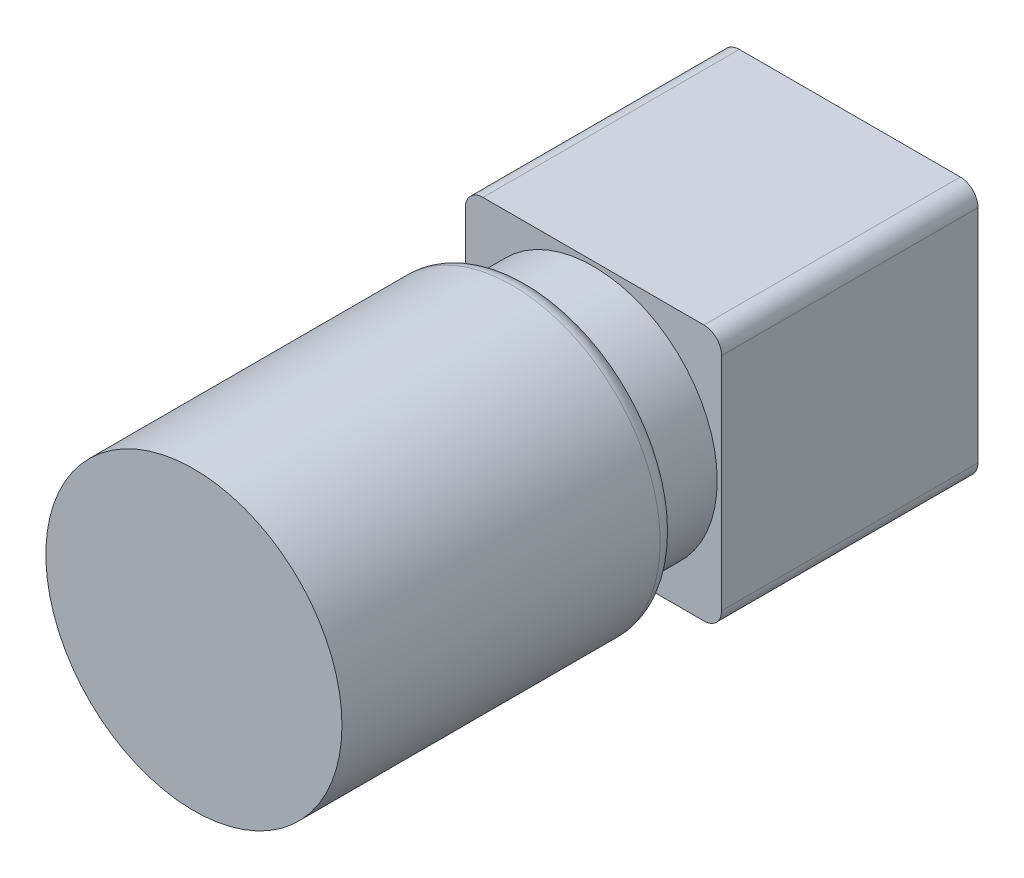
ISO-10303-21;
HEADER;
FILE_DESCRIPTION(('STEP AP214'),'2;1');
FILE_NAME('part.step','',(''),(''),'','','');
FILE_SCHEMA(('AUTOMOTIVE_DESIGN { 1 0 10303 214 1 1 1 1 }'));
ENDSEC;
DATA;
#1=APPLICATION_CONTEXT('core data for automotive mechanical design processes');
#2=APPLICATION_PROTOCOL_DEFINITION('international standard','automotive_design',2000,#1);
#3=PRODUCT_CONTEXT('',#1,'mechanical');
#4=PRODUCT('Part','Part','',(#3));
#5=PRODUCT_RELATED_PRODUCT_CATEGORY('part','',(#4));
#6=PRODUCT_DEFINITION_FORMATION('','',#4);
#7=PRODUCT_DEFINITION_CONTEXT('part definition',#1,'design');
#8=PRODUCT_DEFINITION('design','',#6,#7);
#9=PRODUCT_DEFINITION_SHAPE('','',#8);
#10=(LENGTH_UNIT() NAMED_UNIT(*) SI_UNIT(.MILLI.,.METRE.));
#11=(NAMED_UNIT(*) PLANE_ANGLE_UNIT() SI_UNIT($,.RADIAN.));
#12=(NAMED_UNIT(*) SI_UNIT($,.STERADIAN.) SOLID_ANGLE_UNIT());
#13=UNCERTAINTY_MEASURE_WITH_UNIT(LENGTH_MEASURE(1.E-05),#10,'distance_accuracy_value','');
#14=(GEOMETRIC_REPRESENTATION_CONTEXT(3) GLOBAL_UNCERTAINTY_ASSIGNED_CONTEXT((#13)) GLOBAL_UNIT_ASSIGNED_CONTEXT((#10,
#11,#12)) REPRESENTATION_CONTEXT('',''));
#15=CARTESIAN_POINT('',(0.,0.,0.));
#16=DIRECTION('',(0.,0.,1.));
#17=DIRECTION('',(1.,0.,0.));
#18=AXIS2_PLACEMENT_3D('',#15,#16,#17);
#19=CARTESIAN_POINT('',(0.,0.,0.));
#20=DIRECTION('',(0.,0.,1.));
#21=DIRECTION('',(1.,0.,0.));
#22=AXIS2_PLACEMENT_3D('',#19,#20,#21);
#23=PLANE('',#22);
#24=DIRECTION('',(0.,-1.,0.));
#25=VECTOR('',#24,1.);
#26=CARTESIAN_POINT('',(-14.5,-14.5,0.));
#27=LINE('',#26,#25);
#28=CARTESIAN_POINT('',(-14.5,12.5,0.));
#29=VERTEX_POINT('',#28);
#30=CARTESIAN_POINT('',(-14.5,-12.5,0.));
#31=VERTEX_POINT('',#30);
#32=EDGE_CURVE('E170',#29,#31,#27,.T.);
#33=ORIENTED_EDGE('',*,*,#32,.F.);
#34=CARTESIAN_POINT('',(-12.5,12.5,0.));
#35=DIRECTION('',(0.,0.,1.));
#36=DIRECTION('',(1.,0.,0.));
#37=AXIS2_PLACEMENT_3D('',#34,#35,#36);
#38=CIRCLE('',#37,2.);
#39=CARTESIAN_POINT('',(-12.5,14.5,0.));
#40=VERTEX_POINT('',#39);
#41=EDGE_CURVE('E213',#29,#40,#38,.F.);
#42=ORIENTED_EDGE('',*,*,#41,.T.);
#43=DIRECTION('',(-1.,0.,0.));
#44=VECTOR('',#43,1.);
#45=CARTESIAN_POINT('',(14.5,14.5,0.));
#46=LINE('',#45,#44);
#47=CARTESIAN_POINT('',(12.5,14.5,0.));
#48=VERTEX_POINT('',#47);
#49=EDGE_CURVE('E177',#48,#40,#46,.T.);
#50=ORIENTED_EDGE('',*,*,#49,.F.);
#51=CARTESIAN_POINT('',(12.5,12.5,0.));
#52=DIRECTION('',(0.,0.,1.));
#53=DIRECTION('',(1.,0.,0.));
#54=AXIS2_PLACEMENT_3D('',#51,#52,#53);
#55=CIRCLE('',#54,2.);
#56=CARTESIAN_POINT('',(14.5,12.5,0.));
#57=VERTEX_POINT('',#56);
#58=EDGE_CURVE('E209',#48,#57,#55,.F.);
#59=ORIENTED_EDGE('',*,*,#58,.T.);
#60=DIRECTION('',(0.,1.,0.));
#61=VECTOR('',#60,1.);
#62=CARTESIAN_POINT('',(14.5,-14.5,0.));
#63=LINE('',#62,#61);
#64=CARTESIAN_POINT('',(14.5,-12.5,0.));
#65=VERTEX_POINT('',#64);
#66=EDGE_CURVE('E192',#65,#57,#63,.T.);
#67=ORIENTED_EDGE('',*,*,#66,.F.);
#68=CARTESIAN_POINT('',(12.5,-12.5,0.));
#69=DIRECTION('',(0.,0.,1.));
#70=DIRECTION('',(1.,0.,0.));
#71=AXIS2_PLACEMENT_3D('',#68,#69,#70);
#72=CIRCLE('',#71,2.);
#73=CARTESIAN_POINT('',(12.5,-14.5,0.));
#74=VERTEX_POINT('',#73);
#75=EDGE_CURVE('E207',#65,#74,#72,.F.);
#76=ORIENTED_EDGE('',*,*,#75,.T.);
#77=DIRECTION('',(1.,0.,0.));
#78=VECTOR('',#77,1.);
#79=CARTESIAN_POINT('',(14.5,-14.5,0.));
#80=LINE('',#79,#78);
#81=CARTESIAN_POINT('',(-12.5,-14.5,0.));
#82=VERTEX_POINT('',#81);
#83=EDGE_CURVE('E189',#82,#74,#80,.T.);
#84=ORIENTED_EDGE('',*,*,#83,.F.);
#85=CARTESIAN_POINT('',(-12.5,-12.5,0.));
#86=DIRECTION('',(0.,0.,1.));
#87=DIRECTION('',(1.,0.,0.));
#88=AXIS2_PLACEMENT_3D('',#85,#86,#87);
#89=CIRCLE('',#88,2.);
#90=EDGE_CURVE('E211',#82,#31,#89,.F.);
#91=ORIENTED_EDGE('',*,*,#90,.T.);
#92=EDGE_LOOP('',(#33,#42,#50,#59,#67,#76,#84,#91));
#93=FACE_BOUND('',#92,.T.);
#94=CARTESIAN_POINT('',(9.,9.,0.));
#95=DIRECTION('',(0.,0.,1.));
#96=DIRECTION('',(1.,0.,0.));
#97=AXIS2_PLACEMENT_3D('',#94,#95,#96);
#98=CIRCLE('',#97,2.);
#99=CARTESIAN_POINT('',(9.,7.,0.));
#100=VERTEX_POINT('',#99);
#101=CARTESIAN_POINT('',(11.,9.,0.));
#102=VERTEX_POINT('',#101);
#103=EDGE_CURVE('E47',#100,#102,#98,.T.);
#104=ORIENTED_EDGE('',*,*,#103,.T.);
#105=CARTESIAN_POINT('',(9.,9.,0.));
#106=DIRECTION('',(0.,0.,1.));
#107=DIRECTION('',(1.,0.,0.));
#108=AXIS2_PLACEMENT_3D('',#105,#106,#107);
#109=CIRCLE('',#108,2.);
#110=CARTESIAN_POINT('',(9.,11.,0.));
#111=VERTEX_POINT('',#110);
#112=EDGE_CURVE('E11',#102,#111,#109,.T.);
#113=ORIENTED_EDGE('',*,*,#112,.T.);
#114=DIRECTION('',(1.,0.,0.));
#115=VECTOR('',#114,1.);
#116=CARTESIAN_POINT('',(-11.,11.,0.));
#117=LINE('',#116,#115);
#118=CARTESIAN_POINT('',(-9.,11.,0.));
#119=VERTEX_POINT('',#118);
#120=EDGE_CURVE('E265',#119,#111,#117,.T.);
#121=ORIENTED_EDGE('',*,*,#120,.F.);
#122=CARTESIAN_POINT('',(-9.,9.00000000000001,0.));
#123=DIRECTION('',(0.,0.,1.));
#124=DIRECTION('',(1.,0.,0.));
#125=AXIS2_PLACEMENT_3D('',#122,#123,#124);
#126=CIRCLE('',#125,2.);
#127=CARTESIAN_POINT('',(-11.,9.00000000000001,0.));
#128=VERTEX_POINT('',#127);
#129=EDGE_CURVE('E60',#119,#128,#126,.T.);
#130=ORIENTED_EDGE('',*,*,#129,.T.);
#131=CARTESIAN_POINT('',(-9.,9.00000000000001,0.));
#132=DIRECTION('',(0.,0.,1.));
#133=DIRECTION('',(1.,0.,0.));
#134=AXIS2_PLACEMENT_3D('',#131,#132,#133);
#135=CIRCLE('',#134,2.);
#136=CARTESIAN_POINT('',(-9.,7.,0.));
#137=VERTEX_POINT('',#136);
#138=EDGE_CURVE('E256',#128,#137,#135,.T.);
#139=ORIENTED_EDGE('',*,*,#138,.T.);
#140=DIRECTION('',(-1.,0.,0.));
#141=VECTOR('',#140,1.);
#142=CARTESIAN_POINT('',(-11.,7.,0.));
#143=LINE('',#142,#141);
#144=EDGE_CURVE('E261',#100,#137,#143,.T.);
#145=ORIENTED_EDGE('',*,*,#144,.F.);
#146=EDGE_LOOP('',(#104,#113,#121,#130,#139,#145));
#147=FACE_BOUND('',#146,.T.);
#148=ADVANCED_FACE('F38',(#93,#147),#23,.F.);
#149=CARTESIAN_POINT('',(-14.5,-14.5,29.));
#150=DIRECTION('',(1.,0.,0.));
#151=DIRECTION('',(0.,0.,-1.));
#152=AXIS2_PLACEMENT_3D('',#149,#150,#151);
#153=PLANE('',#152);
#154=DIRECTION('',(0.,-1.,0.));
#155=VECTOR('',#154,1.);
#156=CARTESIAN_POINT('',(-14.5,-14.5,29.));
#157=LINE('',#156,#155);
#158=CARTESIAN_POINT('',(-14.5,12.5,29.));
#159=VERTEX_POINT('',#158);
#160=CARTESIAN_POINT('',(-14.5,-12.5,29.));
#161=VERTEX_POINT('',#160);
#162=EDGE_CURVE('E173',#159,#161,#157,.T.);
#163=ORIENTED_EDGE('',*,*,#162,.F.);
#164=DIRECTION('',(0.,0.,-1.));
#165=VECTOR('',#164,1.);
#166=CARTESIAN_POINT('',(-14.5,12.5,29.));
#167=LINE('',#166,#165);
#168=EDGE_CURVE('E204',#159,#29,#167,.T.);
#169=ORIENTED_EDGE('',*,*,#168,.T.);
#170=ORIENTED_EDGE('',*,*,#32,.T.);
#171=DIRECTION('',(0.,0.,-1.));
#172=VECTOR('',#171,1.);
#173=CARTESIAN_POINT('',(-14.5,-12.5,29.));
#174=LINE('',#173,#172);
#175=EDGE_CURVE('E202',#31,#161,#174,.F.);
#176=ORIENTED_EDGE('',*,*,#175,.T.);
#177=EDGE_LOOP('',(#163,#169,#170,#176));
#178=FACE_BOUND('',#177,.T.);
#179=ADVANCED_FACE('F314',(#178),#153,.F.);
#180=CARTESIAN_POINT('',(14.5,-14.5,29.));
#181=DIRECTION('',(0.,1.,0.));
#182=DIRECTION('',(-1.,0.,0.));
#183=AXIS2_PLACEMENT_3D('',#180,#181,#182);
#184=PLANE('',#183);
#185=CARTESIAN_POINT('',(-10.,-14.5,25.5));
#186=DIRECTION('',(0.,-1.,0.));
#187=DIRECTION('',(0.,0.,-1.));
#188=AXIS2_PLACEMENT_3D('',#185,#186,#187);
#189=CIRCLE('',#188,1.25);
#190=CARTESIAN_POINT('',(-10.,-14.5,24.25));
#191=VERTEX_POINT('',#190);
#192=EDGE_CURVE('E154',#191,#191,#189,.T.);
#193=ORIENTED_EDGE('',*,*,#192,.F.);
#194=EDGE_LOOP('',(#193));
#195=FACE_BOUND('',#194,.T.);
#196=CARTESIAN_POINT('',(10.,-14.5,25.5));
#197=DIRECTION('',(0.,-1.,0.));
#198=DIRECTION('',(0.,0.,-1.));
#199=AXIS2_PLACEMENT_3D('',#196,#197,#198);
#200=CIRCLE('',#199,1.25);
#201=CARTESIAN_POINT('',(10.,-14.5,24.25));
#202=VERTEX_POINT('',#201);
#203=EDGE_CURVE('E153',#202,#202,#200,.T.);
#204=ORIENTED_EDGE('',*,*,#203,.F.);
#205=EDGE_LOOP('',(#204));
#206=FACE_BOUND('',#205,.T.);
#207=DIRECTION('',(1.,0.,0.));
#208=VECTOR('',#207,1.);
#209=CARTESIAN_POINT('',(14.5,-14.5,29.));
#210=LINE('',#209,#208);
#211=CARTESIAN_POINT('',(-12.5,-14.5,29.));
#212=VERTEX_POINT('',#211);
#213=CARTESIAN_POINT('',(12.5,-14.5,29.));
#214=VERTEX_POINT('',#213);
#215=EDGE_CURVE('E176',#212,#214,#210,.T.);
#216=ORIENTED_EDGE('',*,*,#215,.F.);
#217=DIRECTION('',(0.,0.,-1.));
#218=VECTOR('',#217,1.);
#219=CARTESIAN_POINT('',(-12.5,-14.5,29.));
#220=LINE('',#219,#218);
#221=EDGE_CURVE('E230',#212,#82,#220,.T.);
#222=ORIENTED_EDGE('',*,*,#221,.T.);
#223=ORIENTED_EDGE('',*,*,#83,.T.);
#224=DIRECTION('',(0.,0.,-1.));
#225=VECTOR('',#224,1.);
#226=CARTESIAN_POINT('',(12.5,-14.5,29.));
#227=LINE('',#226,#225);
#228=EDGE_CURVE('E228',#74,#214,#227,.F.);
#229=ORIENTED_EDGE('',*,*,#228,.T.);
#230=EDGE_LOOP('',(#216,#222,#223,#229));
#231=FACE_BOUND('',#230,.T.);
#232=ADVANCED_FACE('F320',(#195,#206,#231),#184,.F.);
#233=CARTESIAN_POINT('',(14.5,-14.5,29.));
#234=DIRECTION('',(-1.,0.,0.));
#235=DIRECTION('',(0.,0.,1.));
#236=AXIS2_PLACEMENT_3D('',#233,#234,#235);
#237=PLANE('',#236);
#238=ORIENTED_EDGE('',*,*,#66,.T.);
#239=DIRECTION('',(0.,0.,-1.));
#240=VECTOR('',#239,1.);
#241=CARTESIAN_POINT('',(14.5,12.5,29.));
#242=LINE('',#241,#240);
#243=CARTESIAN_POINT('',(14.5,12.5,29.));
#244=VERTEX_POINT('',#243);
#245=EDGE_CURVE('E236',#57,#244,#242,.F.);
#246=ORIENTED_EDGE('',*,*,#245,.T.);
#247=DIRECTION('',(0.,1.,0.));
#248=VECTOR('',#247,1.);
#249=CARTESIAN_POINT('',(14.5,-14.5,29.));
#250=LINE('',#249,#248);
#251=CARTESIAN_POINT('',(14.5,-12.5,29.));
#252=VERTEX_POINT('',#251);
#253=EDGE_CURVE('E180',#252,#244,#250,.T.);
#254=ORIENTED_EDGE('',*,*,#253,.F.);
#255=DIRECTION('',(0.,0.,-1.));
#256=VECTOR('',#255,1.);
#257=CARTESIAN_POINT('',(14.5,-12.5,29.));
#258=LINE('',#257,#256);
#259=EDGE_CURVE('E233',#252,#65,#258,.T.);
#260=ORIENTED_EDGE('',*,*,#259,.T.);
#261=EDGE_LOOP('',(#238,#246,#254,#260));
#262=FACE_BOUND('',#261,.T.);
#263=ADVANCED_FACE('F331',(#262),#237,.F.);
#264=CARTESIAN_POINT('',(14.5,14.5,29.));
#265=DIRECTION('',(0.,-1.,0.));
#266=DIRECTION('',(1.,0.,0.));
#267=AXIS2_PLACEMENT_3D('',#264,#265,#266);
#268=PLANE('',#267);
#269=ORIENTED_EDGE('',*,*,#49,.T.);
#270=DIRECTION('',(0.,0.,-1.));
#271=VECTOR('',#270,1.);
#272=CARTESIAN_POINT('',(-12.5,14.5,29.));
#273=LINE('',#272,#271);
#274=CARTESIAN_POINT('',(-12.5,14.5,29.));
#275=VERTEX_POINT('',#274);
#276=EDGE_CURVE('E218',#40,#275,#273,.F.);
#277=ORIENTED_EDGE('',*,*,#276,.T.);
#278=DIRECTION('',(-1.,0.,0.));
#279=VECTOR('',#278,1.);
#280=CARTESIAN_POINT('',(14.5,14.5,29.));
#281=LINE('',#280,#279);
#282=CARTESIAN_POINT('',(12.5,14.5,29.));
#283=VERTEX_POINT('',#282);
#284=EDGE_CURVE('E183',#283,#275,#281,.T.);
#285=ORIENTED_EDGE('',*,*,#284,.F.);
#286=DIRECTION('',(0.,0.,-1.));
#287=VECTOR('',#286,1.);
#288=CARTESIAN_POINT('',(12.5,14.5,29.));
#289=LINE('',#288,#287);
#290=EDGE_CURVE('E215',#283,#48,#289,.T.);
#291=ORIENTED_EDGE('',*,*,#290,.T.);
#292=EDGE_LOOP('',(#269,#277,#285,#291));
#293=FACE_BOUND('',#292,.T.);
#294=ADVANCED_FACE('F328',(#293),#268,.F.);
#295=CARTESIAN_POINT('',(0.,0.,29.));
#296=DIRECTION('',(0.,0.,1.));
#297=DIRECTION('',(1.,0.,0.));
#298=AXIS2_PLACEMENT_3D('',#295,#296,#297);
#299=PLANE('',#298);
#300=CARTESIAN_POINT('',(0.,0.,29.));
#301=DIRECTION('',(0.,0.,1.));
#302=DIRECTION('',(1.,0.,0.));
#303=AXIS2_PLACEMENT_3D('',#300,#301,#302);
#304=CIRCLE('',#303,14.);
#305=CARTESIAN_POINT('',(14.,0.,29.));
#306=VERTEX_POINT('',#305);
#307=EDGE_CURVE('E166',#306,#306,#304,.T.);
#308=ORIENTED_EDGE('',*,*,#307,.F.);
#309=EDGE_LOOP('',(#308));
#310=FACE_BOUND('',#309,.T.);
#311=ORIENTED_EDGE('',*,*,#284,.T.);
#312=CARTESIAN_POINT('',(-12.5,12.5,29.));
#313=DIRECTION('',(0.,0.,1.));
#314=DIRECTION('',(1.,0.,0.));
#315=AXIS2_PLACEMENT_3D('',#312,#313,#314);
#316=CIRCLE('',#315,2.);
#317=EDGE_CURVE('E226',#275,#159,#316,.T.);
#318=ORIENTED_EDGE('',*,*,#317,.T.);
#319=ORIENTED_EDGE('',*,*,#162,.T.);
#320=CARTESIAN_POINT('',(-12.5,-12.5,29.));
#321=DIRECTION('',(0.,0.,1.));
#322=DIRECTION('',(1.,0.,0.));
#323=AXIS2_PLACEMENT_3D('',#320,#321,#322);
#324=CIRCLE('',#323,2.);
#325=EDGE_CURVE('E224',#161,#212,#324,.T.);
#326=ORIENTED_EDGE('',*,*,#325,.T.);
#327=ORIENTED_EDGE('',*,*,#215,.T.);
#328=CARTESIAN_POINT('',(12.5,-12.5,29.));
#329=DIRECTION('',(0.,0.,1.));
#330=DIRECTION('',(1.,0.,0.));
#331=AXIS2_PLACEMENT_3D('',#328,#329,#330);
#332=CIRCLE('',#331,2.);
#333=EDGE_CURVE('E220',#214,#252,#332,.T.);
#334=ORIENTED_EDGE('',*,*,#333,.T.);
#335=ORIENTED_EDGE('',*,*,#253,.T.);
#336=CARTESIAN_POINT('',(12.5,12.5,29.));
#337=DIRECTION('',(0.,0.,1.));
#338=DIRECTION('',(1.,0.,0.));
#339=AXIS2_PLACEMENT_3D('',#336,#337,#338);
#340=CIRCLE('',#339,2.);
#341=EDGE_CURVE('E222',#244,#283,#340,.T.);
#342=ORIENTED_EDGE('',*,*,#341,.T.);
#343=EDGE_LOOP('',(#311,#318,#319,#326,#327,#334,#335,#342));
#344=FACE_BOUND('',#343,.T.);
#345=ADVANCED_FACE('F326',(#310,#344),#299,.T.);
#346=CARTESIAN_POINT('',(0.,0.,36.2));
#347=DIRECTION('',(0.,0.,-1.));
#348=DIRECTION('',(-1.,0.,0.));
#349=AXIS2_PLACEMENT_3D('',#346,#347,#348);
#350=CYLINDRICAL_SURFACE('',#349,14.);
#351=CARTESIAN_POINT('',(0.,0.,36.2));
#352=DIRECTION('',(0.,0.,1.));
#353=DIRECTION('',(1.,0.,0.));
#354=AXIS2_PLACEMENT_3D('',#351,#352,#353);
#355=CIRCLE('',#354,14.);
#356=CARTESIAN_POINT('',(14.,0.,36.2));
#357=VERTEX_POINT('',#356);
#358=EDGE_CURVE('E167',#357,#357,#355,.T.);
#359=ORIENTED_EDGE('',*,*,#358,.F.);
#360=EDGE_LOOP('',(#359));
#361=FACE_BOUND('',#360,.T.);
#362=ORIENTED_EDGE('',*,*,#307,.T.);
#363=EDGE_LOOP('',(#362));
#364=FACE_BOUND('',#363,.T.);
#365=ADVANCED_FACE('F463',(#361,#364),#350,.T.);
#366=CARTESIAN_POINT('',(10.,-7.,25.5));
#367=DIRECTION('',(0.,-1.,0.));
#368=DIRECTION('',(0.,0.,-1.));
#369=AXIS2_PLACEMENT_3D('',#366,#367,#368);
#370=CONICAL_SURFACE('',#369,1.25,1.02974425867665);
#371=CARTESIAN_POINT('',(10.,-6.24892422621555,25.5));
#372=VERTEX_POINT('',#371);
#373=VERTEX_LOOP('',#372);
#374=FACE_BOUND('',#373,.T.);
#375=CARTESIAN_POINT('',(10.,-7.,25.5));
#376=DIRECTION('',(0.,-1.,0.));
#377=DIRECTION('',(0.,0.,-1.));
#378=AXIS2_PLACEMENT_3D('',#375,#376,#377);
#379=CIRCLE('',#378,1.25);
#380=CARTESIAN_POINT('',(10.,-7.,24.25));
#381=VERTEX_POINT('',#380);
#382=EDGE_CURVE('E157',#381,#381,#379,.T.);
#383=ORIENTED_EDGE('',*,*,#382,.T.);
#384=EDGE_LOOP('',(#383));
#385=FACE_BOUND('',#384,.T.);
#386=ADVANCED_FACE('F518',(#374,#385),#370,.F.);
#387=CARTESIAN_POINT('',(10.,-14.5,25.5));
#388=DIRECTION('',(0.,-1.,0.));
#389=DIRECTION('',(0.,0.,-1.));
#390=AXIS2_PLACEMENT_3D('',#387,#388,#389);
#391=CYLINDRICAL_SURFACE('',#390,1.25);
#392=ORIENTED_EDGE('',*,*,#382,.F.);
#393=EDGE_LOOP('',(#392));
#394=FACE_BOUND('',#393,.T.);
#395=ORIENTED_EDGE('',*,*,#203,.T.);
#396=EDGE_LOOP('',(#395));
#397=FACE_BOUND('',#396,.T.);
#398=ADVANCED_FACE('F147',(#394,#397),#391,.F.);
#399=CARTESIAN_POINT('',(-10.,-7.,25.5));
#400=DIRECTION('',(0.,-1.,0.));
#401=DIRECTION('',(0.,0.,-1.));
#402=AXIS2_PLACEMENT_3D('',#399,#400,#401);
#403=CONICAL_SURFACE('',#402,1.25,1.02974425867665);
#404=CARTESIAN_POINT('',(-10.,-6.24892422621555,25.5));
#405=VERTEX_POINT('',#404);
#406=VERTEX_LOOP('',#405);
#407=FACE_BOUND('',#406,.T.);
#408=CARTESIAN_POINT('',(-10.,-7.,25.5));
#409=DIRECTION('',(0.,-1.,0.));
#410=DIRECTION('',(0.,0.,-1.));
#411=AXIS2_PLACEMENT_3D('',#408,#409,#410);
#412=CIRCLE('',#411,1.25);
#413=CARTESIAN_POINT('',(-10.,-7.,24.25));
#414=VERTEX_POINT('',#413);
#415=EDGE_CURVE('E151',#414,#414,#412,.T.);
#416=ORIENTED_EDGE('',*,*,#415,.T.);
#417=EDGE_LOOP('',(#416));
#418=FACE_BOUND('',#417,.T.);
#419=ADVANCED_FACE('F143',(#407,#418),#403,.F.);
#420=CARTESIAN_POINT('',(-10.,-14.5,25.5));
#421=DIRECTION('',(0.,-1.,0.));
#422=DIRECTION('',(0.,0.,-1.));
#423=AXIS2_PLACEMENT_3D('',#420,#421,#422);
#424=CYLINDRICAL_SURFACE('',#423,1.25);
#425=ORIENTED_EDGE('',*,*,#415,.F.);
#426=EDGE_LOOP('',(#425));
#427=FACE_BOUND('',#426,.T.);
#428=ORIENTED_EDGE('',*,*,#192,.T.);
#429=EDGE_LOOP('',(#428));
#430=FACE_BOUND('',#429,.T.);
#431=ADVANCED_FACE('F146',(#427,#430),#424,.F.);
#432=CARTESIAN_POINT('',(0.,0.,74.2));
#433=DIRECTION('',(0.,0.,-1.));
#434=DIRECTION('',(-1.,0.,0.));
#435=AXIS2_PLACEMENT_3D('',#432,#433,#434);
#436=CYLINDRICAL_SURFACE('',#435,16.75);
#437=CARTESIAN_POINT('',(0.,0.,38.2));
#438=DIRECTION('',(0.,0.,1.));
#439=DIRECTION('',(1.,0.,0.));
#440=AXIS2_PLACEMENT_3D('',#437,#438,#439);
#441=CIRCLE('',#440,16.75);
#442=CARTESIAN_POINT('',(16.75,0.,38.2));
#443=VERTEX_POINT('',#442);
#444=EDGE_CURVE('E186',#443,#443,#441,.T.);
#445=ORIENTED_EDGE('',*,*,#444,.T.);
#446=EDGE_LOOP('',(#445));
#447=FACE_BOUND('',#446,.T.);
#448=CARTESIAN_POINT('',(0.,0.,74.2));
#449=DIRECTION('',(0.,0.,1.));
#450=DIRECTION('',(1.,0.,0.));
#451=AXIS2_PLACEMENT_3D('',#448,#449,#450);
#452=CIRCLE('',#451,16.75);
#453=CARTESIAN_POINT('',(16.75,0.,74.2));
#454=VERTEX_POINT('',#453);
#455=EDGE_CURVE('E160',#454,#454,#452,.T.);
#456=ORIENTED_EDGE('',*,*,#455,.F.);
#457=EDGE_LOOP('',(#456));
#458=FACE_BOUND('',#457,.T.);
#459=ADVANCED_FACE('F447',(#447,#458),#436,.T.);
#460=CARTESIAN_POINT('',(0.,0.,74.2));
#461=DIRECTION('',(0.,0.,1.));
#462=DIRECTION('',(1.,0.,0.));
#463=AXIS2_PLACEMENT_3D('',#460,#461,#462);
#464=PLANE('',#463);
#465=ORIENTED_EDGE('',*,*,#455,.T.);
#466=EDGE_LOOP('',(#465));
#467=FACE_BOUND('',#466,.T.);
#468=ADVANCED_FACE('F439',(#467),#464,.T.);
#469=CARTESIAN_POINT('',(0.,0.,36.2));
#470=DIRECTION('',(0.,0.,1.));
#471=DIRECTION('',(1.,0.,0.));
#472=AXIS2_PLACEMENT_3D('',#469,#470,#471);
#473=PLANE('',#472);
#474=CARTESIAN_POINT('',(0.,0.,36.2));
#475=DIRECTION('',(0.,0.,1.));
#476=DIRECTION('',(1.,0.,0.));
#477=AXIS2_PLACEMENT_3D('',#474,#475,#476);
#478=CIRCLE('',#477,14.75);
#479=CARTESIAN_POINT('',(14.75,0.,36.2));
#480=VERTEX_POINT('',#479);
#481=EDGE_CURVE('E199',#480,#480,#478,.F.);
#482=ORIENTED_EDGE('',*,*,#481,.T.);
#483=EDGE_LOOP('',(#482));
#484=FACE_BOUND('',#483,.T.);
#485=ORIENTED_EDGE('',*,*,#358,.T.);
#486=EDGE_LOOP('',(#485));
#487=FACE_BOUND('',#486,.T.);
#488=ADVANCED_FACE('F343',(#484,#487),#473,.F.);
#489=CARTESIAN_POINT('',(0.,0.,38.2));
#490=DIRECTION('',(0.,0.,1.));
#491=DIRECTION('',(1.,0.,0.));
#492=AXIS2_PLACEMENT_3D('',#489,#490,#491);
#493=TOROIDAL_SURFACE('',#492,14.75,2.);
#494=ORIENTED_EDGE('',*,*,#481,.F.);
#495=EDGE_LOOP('',(#494));
#496=FACE_BOUND('',#495,.T.);
#497=ORIENTED_EDGE('',*,*,#444,.F.);
#498=EDGE_LOOP('',(#497));
#499=FACE_BOUND('',#498,.T.);
#500=ADVANCED_FACE('F339',(#496,#499),#493,.T.);
#501=CARTESIAN_POINT('',(-12.5,12.5,29.));
#502=DIRECTION('',(0.,0.,-1.));
#503=DIRECTION('',(-1.,0.,0.));
#504=AXIS2_PLACEMENT_3D('',#501,#502,#503);
#505=CYLINDRICAL_SURFACE('',#504,2.);
#506=ORIENTED_EDGE('',*,*,#317,.F.);
#507=ORIENTED_EDGE('',*,*,#276,.F.);
#508=ORIENTED_EDGE('',*,*,#41,.F.);
#509=ORIENTED_EDGE('',*,*,#168,.F.);
#510=EDGE_LOOP('',(#506,#507,#508,#509));
#511=FACE_BOUND('',#510,.T.);
#512=ADVANCED_FACE('F342',(#511),#505,.T.);
#513=CARTESIAN_POINT('',(-12.5,-12.5,29.));
#514=DIRECTION('',(0.,0.,-1.));
#515=DIRECTION('',(-1.,0.,0.));
#516=AXIS2_PLACEMENT_3D('',#513,#514,#515);
#517=CYLINDRICAL_SURFACE('',#516,2.);
#518=ORIENTED_EDGE('',*,*,#325,.F.);
#519=ORIENTED_EDGE('',*,*,#175,.F.);
#520=ORIENTED_EDGE('',*,*,#90,.F.);
#521=ORIENTED_EDGE('',*,*,#221,.F.);
#522=EDGE_LOOP('',(#518,#519,#520,#521));
#523=FACE_BOUND('',#522,.T.);
#524=ADVANCED_FACE('F347',(#523),#517,.T.);
#525=CARTESIAN_POINT('',(12.5,12.5,29.));
#526=DIRECTION('',(0.,0.,-1.));
#527=DIRECTION('',(-1.,0.,0.));
#528=AXIS2_PLACEMENT_3D('',#525,#526,#527);
#529=CYLINDRICAL_SURFACE('',#528,2.);
#530=ORIENTED_EDGE('',*,*,#341,.F.);
#531=ORIENTED_EDGE('',*,*,#245,.F.);
#532=ORIENTED_EDGE('',*,*,#58,.F.);
#533=ORIENTED_EDGE('',*,*,#290,.F.);
#534=EDGE_LOOP('',(#530,#531,#532,#533));
#535=FACE_BOUND('',#534,.T.);
#536=ADVANCED_FACE('F309',(#535),#529,.T.);
#537=CARTESIAN_POINT('',(12.5,-12.5,29.));
#538=DIRECTION('',(0.,0.,-1.));
#539=DIRECTION('',(-1.,0.,0.));
#540=AXIS2_PLACEMENT_3D('',#537,#538,#539);
#541=CYLINDRICAL_SURFACE('',#540,2.);
#542=ORIENTED_EDGE('',*,*,#333,.F.);
#543=ORIENTED_EDGE('',*,*,#228,.F.);
#544=ORIENTED_EDGE('',*,*,#75,.F.);
#545=ORIENTED_EDGE('',*,*,#259,.F.);
#546=EDGE_LOOP('',(#542,#543,#544,#545));
#547=FACE_BOUND('',#546,.T.);
#548=ADVANCED_FACE('F302',(#547),#541,.T.);
#549=CARTESIAN_POINT('',(-11.,7.,-3.5));
#550=DIRECTION('',(0.,1.,0.));
#551=DIRECTION('',(-1.,0.,0.));
#552=AXIS2_PLACEMENT_3D('',#549,#550,#551);
#553=PLANE('',#552);
#554=ORIENTED_EDGE('',*,*,#144,.T.);
#555=DIRECTION('',(0.,0.,1.));
#556=VECTOR('',#555,1.);
#557=CARTESIAN_POINT('',(-9.,7.,-3.5));
#558=LINE('',#557,#556);
#559=CARTESIAN_POINT('',(-9.,7.,-3.5));
#560=VERTEX_POINT('',#559);
#561=EDGE_CURVE('E241',#137,#560,#558,.F.);
#562=ORIENTED_EDGE('',*,*,#561,.T.);
#563=DIRECTION('',(-1.,0.,0.));
#564=VECTOR('',#563,1.);
#565=CARTESIAN_POINT('',(-11.,7.,-3.5));
#566=LINE('',#565,#564);
#567=CARTESIAN_POINT('',(9.,7.,-3.5));
#568=VERTEX_POINT('',#567);
#569=EDGE_CURVE('E282',#568,#560,#566,.T.);
#570=ORIENTED_EDGE('',*,*,#569,.F.);
#571=DIRECTION('',(0.,0.,1.));
#572=VECTOR('',#571,1.);
#573=CARTESIAN_POINT('',(9.,7.,-3.5));
#574=LINE('',#573,#572);
#575=EDGE_CURVE('E238',#568,#100,#574,.T.);
#576=ORIENTED_EDGE('',*,*,#575,.T.);
#577=EDGE_LOOP('',(#554,#562,#570,#576));
#578=FACE_BOUND('',#577,.T.);
#579=ADVANCED_FACE('F299',(#578),#553,.F.);
#580=CARTESIAN_POINT('',(-11.,11.,-3.5));
#581=DIRECTION('',(0.,-1.,0.));
#582=DIRECTION('',(1.,0.,0.));
#583=AXIS2_PLACEMENT_3D('',#580,#581,#582);
#584=PLANE('',#583);
#585=DIRECTION('',(1.,0.,0.));
#586=VECTOR('',#585,1.);
#587=CARTESIAN_POINT('',(-11.,11.,-3.5));
#588=LINE('',#587,#586);
#589=CARTESIAN_POINT('',(-9.,11.,-3.5));
#590=VERTEX_POINT('',#589);
#591=CARTESIAN_POINT('',(9.,11.,-3.5));
#592=VERTEX_POINT('',#591);
#593=EDGE_CURVE('E285',#590,#592,#588,.T.);
#594=ORIENTED_EDGE('',*,*,#593,.F.);
#595=DIRECTION('',(0.,0.,1.));
#596=VECTOR('',#595,1.);
#597=CARTESIAN_POINT('',(-9.,11.,-3.5));
#598=LINE('',#597,#596);
#599=EDGE_CURVE('E254',#590,#119,#598,.T.);
#600=ORIENTED_EDGE('',*,*,#599,.T.);
#601=ORIENTED_EDGE('',*,*,#120,.T.);
#602=DIRECTION('',(0.,0.,1.));
#603=VECTOR('',#602,1.);
#604=CARTESIAN_POINT('',(9.,11.,-3.5));
#605=LINE('',#604,#603);
#606=EDGE_CURVE('E252',#111,#592,#605,.F.);
#607=ORIENTED_EDGE('',*,*,#606,.T.);
#608=EDGE_LOOP('',(#594,#600,#601,#607));
#609=FACE_BOUND('',#608,.T.);
#610=ADVANCED_FACE('F279',(#609),#584,.F.);
#611=CARTESIAN_POINT('',(0.,0.,-3.5));
#612=DIRECTION('',(0.,0.,-1.));
#613=DIRECTION('',(-1.,0.,0.));
#614=AXIS2_PLACEMENT_3D('',#611,#612,#613);
#615=PLANE('',#614);
#616=ORIENTED_EDGE('',*,*,#569,.T.);
#617=CARTESIAN_POINT('',(-9.,9.00000000000001,-3.5));
#618=DIRECTION('',(0.,0.,-1.));
#619=DIRECTION('',(-1.,0.,0.));
#620=AXIS2_PLACEMENT_3D('',#617,#618,#619);
#621=CIRCLE('',#620,2.);
#622=CARTESIAN_POINT('',(-11.,9.00000000000001,-3.5));
#623=VERTEX_POINT('',#622);
#624=EDGE_CURVE('E250',#560,#623,#621,.T.);
#625=ORIENTED_EDGE('',*,*,#624,.T.);
#626=CARTESIAN_POINT('',(-9.,9.00000000000001,-3.5));
#627=DIRECTION('',(0.,0.,-1.));
#628=DIRECTION('',(-1.,0.,0.));
#629=AXIS2_PLACEMENT_3D('',#626,#627,#628);
#630=CIRCLE('',#629,2.);
#631=EDGE_CURVE('E248',#623,#590,#630,.T.);
#632=ORIENTED_EDGE('',*,*,#631,.T.);
#633=ORIENTED_EDGE('',*,*,#593,.T.);
#634=CARTESIAN_POINT('',(9.,9.,-3.5));
#635=DIRECTION('',(0.,0.,-1.));
#636=DIRECTION('',(-1.,0.,0.));
#637=AXIS2_PLACEMENT_3D('',#634,#635,#636);
#638=CIRCLE('',#637,2.);
#639=CARTESIAN_POINT('',(11.,9.,-3.5));
#640=VERTEX_POINT('',#639);
#641=EDGE_CURVE('E244',#592,#640,#638,.T.);
#642=ORIENTED_EDGE('',*,*,#641,.T.);
#643=CARTESIAN_POINT('',(9.,9.,-3.5));
#644=DIRECTION('',(0.,0.,-1.));
#645=DIRECTION('',(-1.,0.,0.));
#646=AXIS2_PLACEMENT_3D('',#643,#644,#645);
#647=CIRCLE('',#646,2.);
#648=EDGE_CURVE('E246',#640,#568,#647,.T.);
#649=ORIENTED_EDGE('',*,*,#648,.T.);
#650=EDGE_LOOP('',(#616,#625,#632,#633,#642,#649));
#651=FACE_BOUND('',#650,.T.);
#652=ADVANCED_FACE('F292',(#651),#615,.T.);
#653=CARTESIAN_POINT('',(-9.,9.00000000000001,-3.5));
#654=DIRECTION('',(0.,0.,1.));
#655=DIRECTION('',(1.,0.,0.));
#656=AXIS2_PLACEMENT_3D('',#653,#654,#655);
#657=CYLINDRICAL_SURFACE('',#656,2.);
#658=ORIENTED_EDGE('',*,*,#599,.F.);
#659=ORIENTED_EDGE('',*,*,#631,.F.);
#660=DIRECTION('',(0.,0.,1.));
#661=VECTOR('',#660,1.);
#662=CARTESIAN_POINT('',(-11.,9.00000000000001,-3.5));
#663=LINE('',#662,#661);
#664=EDGE_CURVE('E259',#128,#623,#663,.F.);
#665=ORIENTED_EDGE('',*,*,#664,.F.);
#666=ORIENTED_EDGE('',*,*,#129,.F.);
#667=EDGE_LOOP('',(#658,#659,#665,#666));
#668=FACE_BOUND('',#667,.T.);
#669=ADVANCED_FACE('F295',(#668),#657,.T.);
#670=CARTESIAN_POINT('',(-9.,9.00000000000001,-3.5));
#671=DIRECTION('',(0.,0.,1.));
#672=DIRECTION('',(1.,0.,0.));
#673=AXIS2_PLACEMENT_3D('',#670,#671,#672);
#674=CYLINDRICAL_SURFACE('',#673,2.);
#675=ORIENTED_EDGE('',*,*,#624,.F.);
#676=ORIENTED_EDGE('',*,*,#561,.F.);
#677=ORIENTED_EDGE('',*,*,#138,.F.);
#678=ORIENTED_EDGE('',*,*,#664,.T.);
#679=EDGE_LOOP('',(#675,#676,#677,#678));
#680=FACE_BOUND('',#679,.T.);
#681=ADVANCED_FACE('F297',(#680),#674,.T.);
#682=CARTESIAN_POINT('',(9.,9.,-3.5));
#683=DIRECTION('',(0.,0.,1.));
#684=DIRECTION('',(1.,0.,0.));
#685=AXIS2_PLACEMENT_3D('',#682,#683,#684);
#686=CYLINDRICAL_SURFACE('',#685,2.);
#687=DIRECTION('',(0.,0.,1.));
#688=VECTOR('',#687,1.);
#689=CARTESIAN_POINT('',(11.,9.,-3.5));
#690=LINE('',#689,#688);
#691=EDGE_CURVE('E42',#640,#102,#690,.T.);
#692=ORIENTED_EDGE('',*,*,#691,.F.);
#693=ORIENTED_EDGE('',*,*,#641,.F.);
#694=ORIENTED_EDGE('',*,*,#606,.F.);
#695=ORIENTED_EDGE('',*,*,#112,.F.);
#696=EDGE_LOOP('',(#692,#693,#694,#695));
#697=FACE_BOUND('',#696,.T.);
#698=ADVANCED_FACE('F40',(#697),#686,.T.);
#699=CARTESIAN_POINT('',(9.,9.,-3.5));
#700=DIRECTION('',(0.,0.,1.));
#701=DIRECTION('',(1.,0.,0.));
#702=AXIS2_PLACEMENT_3D('',#699,#700,#701);
#703=CYLINDRICAL_SURFACE('',#702,2.);
#704=ORIENTED_EDGE('',*,*,#648,.F.);
#705=ORIENTED_EDGE('',*,*,#691,.T.);
#706=ORIENTED_EDGE('',*,*,#103,.F.);
#707=ORIENTED_EDGE('',*,*,#575,.F.);
#708=EDGE_LOOP('',(#704,#705,#706,#707));
#709=FACE_BOUND('',#708,.T.);
#710=ADVANCED_FACE('F271',(#709),#703,.T.);
#711=CLOSED_SHELL('',(#148,#179,#232,#263,#294,#345,#365,#386,#398,#419,#431,#459,#468,#488,
#500,#512,#524,#536,#548,#579,#610,#652,#669,#681,#698,#710));
#712=MANIFOLD_SOLID_BREP('B2',#711);
#713=ADVANCED_BREP_SHAPE_REPRESENTATION('',(#18,#712),#14);
#714=SHAPE_DEFINITION_REPRESENTATION(#9,#713);
ENDSEC;
END-ISO-10303-21;
